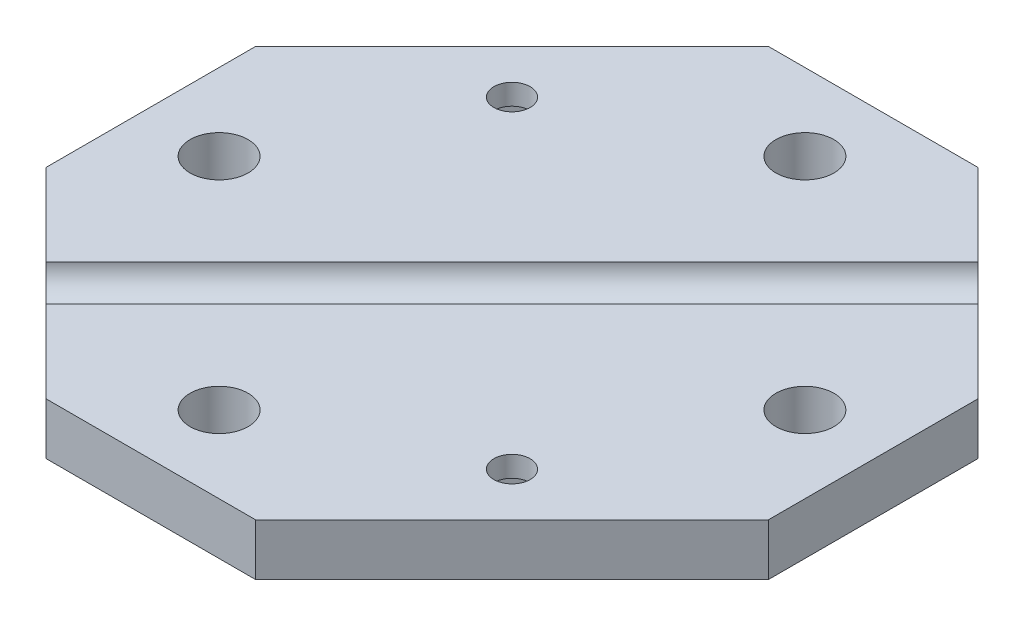
ISO-10303-21;
HEADER;
FILE_DESCRIPTION(('STEP AP214'),'2;1');
FILE_NAME('part.step','',(''),(''),'','','');
FILE_SCHEMA(('AUTOMOTIVE_DESIGN { 1 0 10303 214 1 1 1 1 }'));
ENDSEC;
DATA;
#1=APPLICATION_CONTEXT('core data for automotive mechanical design processes');
#2=APPLICATION_PROTOCOL_DEFINITION('international standard','automotive_design',2000,#1);
#3=PRODUCT_CONTEXT('',#1,'mechanical');
#4=PRODUCT('Part','Part','',(#3));
#5=PRODUCT_RELATED_PRODUCT_CATEGORY('part','',(#4));
#6=PRODUCT_DEFINITION_FORMATION('','',#4);
#7=PRODUCT_DEFINITION_CONTEXT('part definition',#1,'design');
#8=PRODUCT_DEFINITION('design','',#6,#7);
#9=PRODUCT_DEFINITION_SHAPE('','',#8);
#10=(LENGTH_UNIT() NAMED_UNIT(*) SI_UNIT(.MILLI.,.METRE.));
#11=(NAMED_UNIT(*) PLANE_ANGLE_UNIT() SI_UNIT($,.RADIAN.));
#12=(NAMED_UNIT(*) SI_UNIT($,.STERADIAN.) SOLID_ANGLE_UNIT());
#13=UNCERTAINTY_MEASURE_WITH_UNIT(LENGTH_MEASURE(1.E-05),#10,'distance_accuracy_value','');
#14=(GEOMETRIC_REPRESENTATION_CONTEXT(3) GLOBAL_UNCERTAINTY_ASSIGNED_CONTEXT((#13)) GLOBAL_UNIT_ASSIGNED_CONTEXT((#10,
#11,#12)) REPRESENTATION_CONTEXT('',''));
#15=CARTESIAN_POINT('',(0.,0.,0.));
#16=DIRECTION('',(0.,0.,1.));
#17=DIRECTION('',(1.,0.,0.));
#18=AXIS2_PLACEMENT_3D('',#15,#16,#17);
#19=CARTESIAN_POINT('',(0.,5.,0.));
#20=DIRECTION('',(0.,-1.,0.));
#21=DIRECTION('',(0.,0.,-1.));
#22=AXIS2_PLACEMENT_3D('',#19,#20,#21);
#23=PLANE('',#22);
#24=CARTESIAN_POINT('',(-23.6869337565123,5.,-23.6869337565124));
#25=DIRECTION('',(0.,1.,0.));
#26=DIRECTION('',(0.,0.,1.));
#27=AXIS2_PLACEMENT_3D('',#24,#25,#26);
#28=CIRCLE('',#27,1.75000000000001);
#29=CARTESIAN_POINT('',(-23.6869337565123,5.,-21.9369337565123));
#30=VERTEX_POINT('',#29);
#31=EDGE_CURVE('E777',#30,#30,#28,.T.);
#32=ORIENTED_EDGE('',*,*,#31,.F.);
#33=EDGE_LOOP('',(#32));
#34=FACE_BOUND('',#33,.T.);
#35=CARTESIAN_POINT('',(-32.8793219119375,5.,-4.59505066447559));
#36=DIRECTION('',(0.,1.,0.));
#37=DIRECTION('',(0.,0.,1.));
#38=AXIS2_PLACEMENT_3D('',#35,#36,#37);
#39=CIRCLE('',#38,2.8);
#40=CARTESIAN_POINT('',(-32.8793219119375,5.,-1.79505066447559));
#41=VERTEX_POINT('',#40);
#42=EDGE_CURVE('E351',#41,#41,#39,.T.);
#43=ORIENTED_EDGE('',*,*,#42,.F.);
#44=EDGE_LOOP('',(#43));
#45=FACE_BOUND('',#44,.T.);
#46=CARTESIAN_POINT('',(-4.59505066447554,5.,-32.8793219119374));
#47=DIRECTION('',(0.,1.,0.));
#48=DIRECTION('',(0.,0.,1.));
#49=AXIS2_PLACEMENT_3D('',#46,#47,#48);
#50=CIRCLE('',#49,2.8);
#51=CARTESIAN_POINT('',(-4.59505066447554,5.,-30.0793219119374));
#52=VERTEX_POINT('',#51);
#53=EDGE_CURVE('E359',#52,#52,#50,.T.);
#54=ORIENTED_EDGE('',*,*,#53,.F.);
#55=EDGE_LOOP('',(#54));
#56=FACE_BOUND('',#55,.T.);
#57=DIRECTION('',(0.707106781186547,0.,0.707106781186549));
#58=VECTOR('',#57,1.);
#59=CARTESIAN_POINT('',(-40.3039431143962,5.,4.69479422713291));
#60=LINE('',#59,#58);
#61=CARTESIAN_POINT('',(-40.3039431143962,5.,4.69479422713291));
#62=VERTEX_POINT('',#61);
#63=CARTESIAN_POINT('',(-32.3977201941393,5.,12.6010171473899));
#64=VERTEX_POINT('',#63);
#65=EDGE_CURVE('E389',#62,#64,#60,.T.);
#66=ORIENTED_EDGE('',*,*,#65,.T.);
#67=DIRECTION('',(0.707106781186549,0.,-0.707106781186546));
#68=VECTOR('',#67,1.);
#69=CARTESIAN_POINT('',(-42.0727100673626,5.,22.2760070206132));
#70=LINE('',#69,#68);
#71=CARTESIAN_POINT('',(12.60101714739,5.,-32.3977201941392));
#72=VERTEX_POINT('',#71);
#73=EDGE_CURVE('E343',#64,#72,#70,.T.);
#74=ORIENTED_EDGE('',*,*,#73,.T.);
#75=DIRECTION('',(-0.707106781186546,0.,-0.707106781186549));
#76=VECTOR('',#75,1.);
#77=CARTESIAN_POINT('',(4.69479422713301,5.,-40.3039431143962));
#78=LINE('',#77,#76);
#79=CARTESIAN_POINT('',(4.69479422713301,5.,-40.3039431143962));
#80=VERTEX_POINT('',#79);
#81=EDGE_CURVE('E402',#72,#80,#78,.T.);
#82=ORIENTED_EDGE('',*,*,#81,.T.);
#83=DIRECTION('',(-1.,0.,0.));
#84=VECTOR('',#83,1.);
#85=CARTESIAN_POINT('',(-15.555205772867,5.,-40.3039431143962));
#86=LINE('',#85,#84);
#87=CARTESIAN_POINT('',(-15.555205772867,5.,-40.3039431143962));
#88=VERTEX_POINT('',#87);
#89=EDGE_CURVE('E407',#80,#88,#86,.T.);
#90=ORIENTED_EDGE('',*,*,#89,.T.);
#91=DIRECTION('',(-0.707106781186549,0.,0.707106781186546));
#92=VECTOR('',#91,1.);
#93=CARTESIAN_POINT('',(-40.3039431143962,5.,-15.5552057728671));
#94=LINE('',#93,#92);
#95=CARTESIAN_POINT('',(-40.3039431143962,5.,-15.5552057728671));
#96=VERTEX_POINT('',#95);
#97=EDGE_CURVE('E410',#88,#96,#94,.T.);
#98=ORIENTED_EDGE('',*,*,#97,.T.);
#99=DIRECTION('',(0.,0.,1.));
#100=VECTOR('',#99,1.);
#101=CARTESIAN_POINT('',(-40.3039431143962,5.,-15.5552057728671));
#102=LINE('',#101,#100);
#103=EDGE_CURVE('E383',#96,#62,#102,.T.);
#104=ORIENTED_EDGE('',*,*,#103,.T.);
#105=EDGE_LOOP('',(#66,#74,#82,#90,#98,#104));
#106=FACE_BOUND('',#105,.T.);
#107=ADVANCED_FACE('F45',(#34,#45,#56,#106),#23,.F.);
#108=CARTESIAN_POINT('',(7.42576461569574,5.,7.42576461569574));
#109=DIRECTION('',(0.,1.,0.));
#110=DIRECTION('',(0.,0.,1.));
#111=AXIS2_PLACEMENT_3D('',#108,#109,#110);
#112=CIRCLE('',#111,1.75);
#113=CARTESIAN_POINT('',(7.42576461569574,5.,9.17576461569574));
#114=VERTEX_POINT('',#113);
#115=EDGE_CURVE('E228',#114,#114,#112,.T.);
#116=ORIENTED_EDGE('',*,*,#115,.F.);
#117=EDGE_LOOP('',(#116));
#118=FACE_BOUND('',#117,.T.);
#119=CARTESIAN_POINT('',(24.0427739735796,5.,-20.9559633679495));
#120=VERTEX_POINT('',#119);
#121=CARTESIAN_POINT('',(16.1365510533227,5.,-28.8621862882065));
#122=VERTEX_POINT('',#121);
#123=EDGE_CURVE('E403',#120,#122,#78,.T.);
#124=ORIENTED_EDGE('',*,*,#123,.T.);
#125=DIRECTION('',(0.707106781186549,0.,-0.707106781186546));
#126=VECTOR('',#125,1.);
#127=CARTESIAN_POINT('',(-38.5371761614299,5.,25.8115409265459));
#128=LINE('',#127,#126);
#129=CARTESIAN_POINT('',(-28.8621862882066,5.,16.1365510533226));
#130=VERTEX_POINT('',#129);
#131=EDGE_CURVE('E344',#130,#122,#128,.T.);
#132=ORIENTED_EDGE('',*,*,#131,.F.);
#133=CARTESIAN_POINT('',(-20.9559633679496,5.,24.0427739735796));
#134=VERTEX_POINT('',#133);
#135=EDGE_CURVE('E387',#130,#134,#60,.T.);
#136=ORIENTED_EDGE('',*,*,#135,.T.);
#137=DIRECTION('',(1.,0.,0.));
#138=VECTOR('',#137,1.);
#139=CARTESIAN_POINT('',(-0.705963367949583,5.,24.0427739735796));
#140=LINE('',#139,#138);
#141=CARTESIAN_POINT('',(-0.705963367949583,5.,24.0427739735796));
#142=VERTEX_POINT('',#141);
#143=EDGE_CURVE('E393',#134,#142,#140,.T.);
#144=ORIENTED_EDGE('',*,*,#143,.T.);
#145=DIRECTION('',(0.707106781186549,0.,-0.707106781186546));
#146=VECTOR('',#145,1.);
#147=CARTESIAN_POINT('',(-0.705963367949583,5.,24.0427739735796));
#148=LINE('',#147,#146);
#149=CARTESIAN_POINT('',(24.0427739735796,5.,-0.705963367949539));
#150=VERTEX_POINT('',#149);
#151=EDGE_CURVE('E396',#142,#150,#148,.T.);
#152=ORIENTED_EDGE('',*,*,#151,.T.);
#153=DIRECTION('',(0.,0.,-1.));
#154=VECTOR('',#153,1.);
#155=CARTESIAN_POINT('',(24.0427739735796,5.,-0.705963367949539));
#156=LINE('',#155,#154);
#157=EDGE_CURVE('E399',#150,#120,#156,.T.);
#158=ORIENTED_EDGE('',*,*,#157,.T.);
#159=EDGE_LOOP('',(#124,#132,#136,#144,#152,#158));
#160=FACE_BOUND('',#159,.T.);
#161=CARTESIAN_POINT('',(-11.6661184763411,5.,16.6181527711208));
#162=DIRECTION('',(0.,1.,0.));
#163=DIRECTION('',(0.,0.,1.));
#164=AXIS2_PLACEMENT_3D('',#161,#162,#163);
#165=CIRCLE('',#164,2.8);
#166=CARTESIAN_POINT('',(-11.6661184763411,5.,19.4181527711208));
#167=VERTEX_POINT('',#166);
#168=EDGE_CURVE('E375',#167,#167,#165,.T.);
#169=ORIENTED_EDGE('',*,*,#168,.F.);
#170=EDGE_LOOP('',(#169));
#171=FACE_BOUND('',#170,.T.);
#172=CARTESIAN_POINT('',(16.6181527711209,5.,-11.666118476341));
#173=DIRECTION('',(0.,1.,0.));
#174=DIRECTION('',(0.,0.,1.));
#175=AXIS2_PLACEMENT_3D('',#172,#173,#174);
#176=CIRCLE('',#175,2.8);
#177=CARTESIAN_POINT('',(16.6181527711209,5.,-8.86611847634102));
#178=VERTEX_POINT('',#177);
#179=EDGE_CURVE('E367',#178,#178,#176,.T.);
#180=ORIENTED_EDGE('',*,*,#179,.F.);
#181=EDGE_LOOP('',(#180));
#182=FACE_BOUND('',#181,.T.);
#183=ADVANCED_FACE('F485',(#118,#160,#171,#182),#23,.F.);
#184=CARTESIAN_POINT('',(0.,0.,0.));
#185=DIRECTION('',(0.,-1.,0.));
#186=DIRECTION('',(0.,0.,-1.));
#187=AXIS2_PLACEMENT_3D('',#184,#185,#186);
#188=PLANE('',#187);
#189=DIRECTION('',(-0.258819045102521,0.,-0.965925826289068));
#190=VECTOR('',#189,1.);
#191=CARTESIAN_POINT('',(-20.5081718023086,0.,-22.8351870579527));
#192=LINE('',#191,#190);
#193=CARTESIAN_POINT('',(-20.5081718023086,0.,-22.8351870579527));
#194=VERTEX_POINT('',#193);
#195=CARTESIAN_POINT('',(-21.3599185008683,0.,-26.0139490121564));
#196=VERTEX_POINT('',#195);
#197=EDGE_CURVE('E199',#194,#196,#192,.T.);
#198=ORIENTED_EDGE('',*,*,#197,.T.);
#199=DIRECTION('',(-0.965925826289068,0.,-0.258819045102521));
#200=VECTOR('',#199,1.);
#201=CARTESIAN_POINT('',(-21.3599185008683,0.,-26.0139490121564));
#202=LINE('',#201,#200);
#203=CARTESIAN_POINT('',(-24.5386804550719,0.,-26.865695710716));
#204=VERTEX_POINT('',#203);
#205=EDGE_CURVE('E211',#196,#204,#202,.T.);
#206=ORIENTED_EDGE('',*,*,#205,.T.);
#207=DIRECTION('',(-0.707106781186548,0.,0.707106781186548));
#208=VECTOR('',#207,1.);
#209=CARTESIAN_POINT('',(-24.5386804550719,0.,-26.865695710716));
#210=LINE('',#209,#208);
#211=CARTESIAN_POINT('',(-26.865695710716,0.,-24.538680455072));
#212=VERTEX_POINT('',#211);
#213=EDGE_CURVE('E61',#204,#212,#210,.T.);
#214=ORIENTED_EDGE('',*,*,#213,.T.);
#215=DIRECTION('',(0.258819045102521,0.,0.965925826289068));
#216=VECTOR('',#215,1.);
#217=CARTESIAN_POINT('',(-26.865695710716,0.,-24.538680455072));
#218=LINE('',#217,#216);
#219=CARTESIAN_POINT('',(-26.0139490121563,0.,-21.3599185008683));
#220=VERTEX_POINT('',#219);
#221=EDGE_CURVE('E233',#212,#220,#218,.T.);
#222=ORIENTED_EDGE('',*,*,#221,.T.);
#223=DIRECTION('',(0.965925826289068,0.,0.258819045102521));
#224=VECTOR('',#223,1.);
#225=CARTESIAN_POINT('',(-26.0139490121563,0.,-21.3599185008683));
#226=LINE('',#225,#224);
#227=CARTESIAN_POINT('',(-22.8351870579526,0.,-20.5081718023087));
#228=VERTEX_POINT('',#227);
#229=EDGE_CURVE('E237',#220,#228,#226,.T.);
#230=ORIENTED_EDGE('',*,*,#229,.T.);
#231=DIRECTION('',(0.707106781186548,0.,-0.707106781186548));
#232=VECTOR('',#231,1.);
#233=CARTESIAN_POINT('',(-22.8351870579526,0.,-20.5081718023087));
#234=LINE('',#233,#232);
#235=EDGE_CURVE('E208',#228,#194,#234,.T.);
#236=ORIENTED_EDGE('',*,*,#235,.T.);
#237=EDGE_LOOP('',(#198,#206,#214,#222,#230,#236));
#238=FACE_BOUND('',#237,.T.);
#239=DIRECTION('',(-0.258819045102519,0.,-0.965925826289069));
#240=VECTOR('',#239,1.);
#241=CARTESIAN_POINT('',(10.6045265698995,0.,8.27751131425526));
#242=LINE('',#241,#240);
#243=CARTESIAN_POINT('',(10.6045265698995,0.,8.27751131425526));
#244=VERTEX_POINT('',#243);
#245=CARTESIAN_POINT('',(9.75277987133989,0.,5.09874936005159));
#246=VERTEX_POINT('',#245);
#247=EDGE_CURVE('E299',#244,#246,#242,.T.);
#248=ORIENTED_EDGE('',*,*,#247,.T.);
#249=DIRECTION('',(-0.965925826289068,0.,-0.258819045102522));
#250=VECTOR('',#249,1.);
#251=CARTESIAN_POINT('',(9.75277987133989,0.,5.09874936005159));
#252=LINE('',#251,#250);
#253=CARTESIAN_POINT('',(6.57401791713622,0.,4.24700266149193));
#254=VERTEX_POINT('',#253);
#255=EDGE_CURVE('E331',#246,#254,#252,.T.);
#256=ORIENTED_EDGE('',*,*,#255,.T.);
#257=DIRECTION('',(-0.707106781186549,0.,0.707106781186547));
#258=VECTOR('',#257,1.);
#259=CARTESIAN_POINT('',(6.57401791713622,0.,4.24700266149193));
#260=LINE('',#259,#258);
#261=CARTESIAN_POINT('',(4.2470026614922,0.,6.57401791713594));
#262=VERTEX_POINT('',#261);
#263=EDGE_CURVE('E69',#254,#262,#260,.T.);
#264=ORIENTED_EDGE('',*,*,#263,.T.);
#265=DIRECTION('',(0.258819045102519,0.,0.965925826289069));
#266=VECTOR('',#265,1.);
#267=CARTESIAN_POINT('',(4.2470026614922,0.,6.57401791713594));
#268=LINE('',#267,#266);
#269=CARTESIAN_POINT('',(5.09874936005185,0.,9.75277987133961));
#270=VERTEX_POINT('',#269);
#271=EDGE_CURVE('E325',#262,#270,#268,.T.);
#272=ORIENTED_EDGE('',*,*,#271,.T.);
#273=DIRECTION('',(0.965925826289068,0.,0.258819045102522));
#274=VECTOR('',#273,1.);
#275=CARTESIAN_POINT('',(5.09874936005185,0.,9.75277987133961));
#276=LINE('',#275,#274);
#277=CARTESIAN_POINT('',(8.27751131425551,0.,10.6045265698993));
#278=VERTEX_POINT('',#277);
#279=EDGE_CURVE('E321',#270,#278,#276,.T.);
#280=ORIENTED_EDGE('',*,*,#279,.T.);
#281=DIRECTION('',(0.707106781186549,0.,-0.707106781186546));
#282=VECTOR('',#281,1.);
#283=CARTESIAN_POINT('',(8.27751131425551,0.,10.6045265698993));
#284=LINE('',#283,#282);
#285=EDGE_CURVE('E277',#278,#244,#284,.T.);
#286=ORIENTED_EDGE('',*,*,#285,.T.);
#287=EDGE_LOOP('',(#248,#256,#264,#272,#280,#286));
#288=FACE_BOUND('',#287,.T.);
#289=CARTESIAN_POINT('',(-4.59505066447554,0.,-32.8793219119374));
#290=DIRECTION('',(0.,1.,0.));
#291=DIRECTION('',(0.,0.,1.));
#292=AXIS2_PLACEMENT_3D('',#289,#290,#291);
#293=CIRCLE('',#292,2.8);
#294=CARTESIAN_POINT('',(-4.59505066447554,0.,-30.0793219119374));
#295=VERTEX_POINT('',#294);
#296=EDGE_CURVE('E355',#295,#295,#293,.T.);
#297=ORIENTED_EDGE('',*,*,#296,.T.);
#298=EDGE_LOOP('',(#297));
#299=FACE_BOUND('',#298,.T.);
#300=CARTESIAN_POINT('',(-11.6661184763411,0.,16.6181527711208));
#301=DIRECTION('',(0.,1.,0.));
#302=DIRECTION('',(0.,0.,1.));
#303=AXIS2_PLACEMENT_3D('',#300,#301,#302);
#304=CIRCLE('',#303,2.8);
#305=CARTESIAN_POINT('',(-11.6661184763411,0.,19.4181527711208));
#306=VERTEX_POINT('',#305);
#307=EDGE_CURVE('E371',#306,#306,#304,.T.);
#308=ORIENTED_EDGE('',*,*,#307,.T.);
#309=EDGE_LOOP('',(#308));
#310=FACE_BOUND('',#309,.T.);
#311=DIRECTION('',(0.,0.,1.));
#312=VECTOR('',#311,1.);
#313=CARTESIAN_POINT('',(-40.3039431143962,0.,-15.5552057728671));
#314=LINE('',#313,#312);
#315=CARTESIAN_POINT('',(-40.3039431143962,0.,-15.5552057728671));
#316=VERTEX_POINT('',#315);
#317=CARTESIAN_POINT('',(-40.3039431143962,0.,4.69479422713291));
#318=VERTEX_POINT('',#317);
#319=EDGE_CURVE('E379',#316,#318,#314,.T.);
#320=ORIENTED_EDGE('',*,*,#319,.F.);
#321=DIRECTION('',(-0.707106781186549,0.,0.707106781186546));
#322=VECTOR('',#321,1.);
#323=CARTESIAN_POINT('',(-40.3039431143962,0.,-15.5552057728671));
#324=LINE('',#323,#322);
#325=CARTESIAN_POINT('',(-15.555205772867,0.,-40.3039431143962));
#326=VERTEX_POINT('',#325);
#327=EDGE_CURVE('E388',#326,#316,#324,.T.);
#328=ORIENTED_EDGE('',*,*,#327,.F.);
#329=DIRECTION('',(-1.,0.,0.));
#330=VECTOR('',#329,1.);
#331=CARTESIAN_POINT('',(-15.555205772867,0.,-40.3039431143962));
#332=LINE('',#331,#330);
#333=CARTESIAN_POINT('',(4.69479422713301,0.,-40.3039431143962));
#334=VERTEX_POINT('',#333);
#335=EDGE_CURVE('E432',#334,#326,#332,.T.);
#336=ORIENTED_EDGE('',*,*,#335,.F.);
#337=DIRECTION('',(-0.707106781186546,0.,-0.707106781186549));
#338=VECTOR('',#337,1.);
#339=CARTESIAN_POINT('',(4.69479422713301,0.,-40.3039431143962));
#340=LINE('',#339,#338);
#341=CARTESIAN_POINT('',(24.0427739735796,0.,-20.9559633679495));
#342=VERTEX_POINT('',#341);
#343=EDGE_CURVE('E429',#342,#334,#340,.T.);
#344=ORIENTED_EDGE('',*,*,#343,.F.);
#345=DIRECTION('',(0.,0.,-1.));
#346=VECTOR('',#345,1.);
#347=CARTESIAN_POINT('',(24.0427739735796,0.,-0.705963367949539));
#348=LINE('',#347,#346);
#349=CARTESIAN_POINT('',(24.0427739735796,0.,-0.705963367949539));
#350=VERTEX_POINT('',#349);
#351=EDGE_CURVE('E426',#350,#342,#348,.T.);
#352=ORIENTED_EDGE('',*,*,#351,.F.);
#353=DIRECTION('',(0.707106781186549,0.,-0.707106781186546));
#354=VECTOR('',#353,1.);
#355=CARTESIAN_POINT('',(-0.705963367949583,0.,24.0427739735796));
#356=LINE('',#355,#354);
#357=CARTESIAN_POINT('',(-0.705963367949583,0.,24.0427739735796));
#358=VERTEX_POINT('',#357);
#359=EDGE_CURVE('E423',#358,#350,#356,.T.);
#360=ORIENTED_EDGE('',*,*,#359,.F.);
#361=DIRECTION('',(1.,0.,0.));
#362=VECTOR('',#361,1.);
#363=CARTESIAN_POINT('',(-0.705963367949583,0.,24.0427739735796));
#364=LINE('',#363,#362);
#365=CARTESIAN_POINT('',(-20.9559633679496,0.,24.0427739735796));
#366=VERTEX_POINT('',#365);
#367=EDGE_CURVE('E420',#366,#358,#364,.T.);
#368=ORIENTED_EDGE('',*,*,#367,.F.);
#369=DIRECTION('',(0.707106781186547,0.,0.707106781186549));
#370=VECTOR('',#369,1.);
#371=CARTESIAN_POINT('',(-40.3039431143962,0.,4.69479422713291));
#372=LINE('',#371,#370);
#373=EDGE_CURVE('E417',#318,#366,#372,.T.);
#374=ORIENTED_EDGE('',*,*,#373,.F.);
#375=EDGE_LOOP('',(#320,#328,#336,#344,#352,#360,#368,#374));
#376=FACE_BOUND('',#375,.T.);
#377=CARTESIAN_POINT('',(16.6181527711209,0.,-11.666118476341));
#378=DIRECTION('',(0.,1.,0.));
#379=DIRECTION('',(0.,0.,1.));
#380=AXIS2_PLACEMENT_3D('',#377,#378,#379);
#381=CIRCLE('',#380,2.8);
#382=CARTESIAN_POINT('',(16.6181527711209,0.,-8.86611847634102));
#383=VERTEX_POINT('',#382);
#384=EDGE_CURVE('E363',#383,#383,#381,.T.);
#385=ORIENTED_EDGE('',*,*,#384,.T.);
#386=EDGE_LOOP('',(#385));
#387=FACE_BOUND('',#386,.T.);
#388=CARTESIAN_POINT('',(-32.8793219119375,0.,-4.59505066447559));
#389=DIRECTION('',(0.,1.,0.));
#390=DIRECTION('',(0.,0.,1.));
#391=AXIS2_PLACEMENT_3D('',#388,#389,#390);
#392=CIRCLE('',#391,2.8);
#393=CARTESIAN_POINT('',(-32.8793219119375,0.,-1.79505066447559));
#394=VERTEX_POINT('',#393);
#395=EDGE_CURVE('E347',#394,#394,#392,.T.);
#396=ORIENTED_EDGE('',*,*,#395,.T.);
#397=EDGE_LOOP('',(#396));
#398=FACE_BOUND('',#397,.T.);
#399=ADVANCED_FACE('F216',(#238,#288,#299,#310,#376,#387,#398),#188,.T.);
#400=CARTESIAN_POINT('',(-40.3039431143962,5.,-15.5552057728671));
#401=DIRECTION('',(1.,0.,0.));
#402=DIRECTION('',(0.,0.,-1.));
#403=AXIS2_PLACEMENT_3D('',#400,#401,#402);
#404=PLANE('',#403);
#405=ORIENTED_EDGE('',*,*,#319,.T.);
#406=DIRECTION('',(0.,-1.,0.));
#407=VECTOR('',#406,1.);
#408=CARTESIAN_POINT('',(-40.3039431143962,5.,4.69479422713291));
#409=LINE('',#408,#407);
#410=EDGE_CURVE('E11',#62,#318,#409,.T.);
#411=ORIENTED_EDGE('',*,*,#410,.F.);
#412=ORIENTED_EDGE('',*,*,#103,.F.);
#413=DIRECTION('',(0.,-1.,0.));
#414=VECTOR('',#413,1.);
#415=CARTESIAN_POINT('',(-40.3039431143962,5.,-15.5552057728671));
#416=LINE('',#415,#414);
#417=EDGE_CURVE('E413',#96,#316,#416,.T.);
#418=ORIENTED_EDGE('',*,*,#417,.T.);
#419=EDGE_LOOP('',(#405,#411,#412,#418));
#420=FACE_BOUND('',#419,.T.);
#421=ADVANCED_FACE('F47',(#420),#404,.F.);
#422=CARTESIAN_POINT('',(-40.3039431143962,5.,4.69479422713291));
#423=DIRECTION('',(0.707106781186548,0.,-0.707106781186547));
#424=DIRECTION('',(-0.707106781186547,0.,-0.707106781186548));
#425=AXIS2_PLACEMENT_3D('',#422,#423,#424);
#426=PLANE('',#425);
#427=ORIENTED_EDGE('',*,*,#135,.F.);
#428=CARTESIAN_POINT('',(-30.6299532411729,5.,14.3687841003562));
#429=DIRECTION('',(0.707106781186548,0.,-0.707106781186547));
#430=DIRECTION('',(-0.707106781186547,0.,-0.707106781186548));
#431=AXIS2_PLACEMENT_3D('',#428,#429,#430);
#432=CIRCLE('',#431,2.5);
#433=EDGE_CURVE('E262',#64,#130,#432,.F.);
#434=ORIENTED_EDGE('',*,*,#433,.F.);
#435=ORIENTED_EDGE('',*,*,#65,.F.);
#436=ORIENTED_EDGE('',*,*,#410,.T.);
#437=ORIENTED_EDGE('',*,*,#373,.T.);
#438=DIRECTION('',(0.,-1.,0.));
#439=VECTOR('',#438,1.);
#440=CARTESIAN_POINT('',(-20.9559633679496,5.,24.0427739735796));
#441=LINE('',#440,#439);
#442=EDGE_CURVE('E54',#134,#366,#441,.T.);
#443=ORIENTED_EDGE('',*,*,#442,.F.);
#444=EDGE_LOOP('',(#427,#434,#435,#436,#437,#443));
#445=FACE_BOUND('',#444,.T.);
#446=ADVANCED_FACE('F510',(#445),#426,.F.);
#447=CARTESIAN_POINT('',(-0.705963367949583,5.,24.0427739735796));
#448=DIRECTION('',(0.,0.,-1.));
#449=DIRECTION('',(-1.,0.,0.));
#450=AXIS2_PLACEMENT_3D('',#447,#448,#449);
#451=PLANE('',#450);
#452=ORIENTED_EDGE('',*,*,#367,.T.);
#453=DIRECTION('',(0.,-1.,0.));
#454=VECTOR('',#453,1.);
#455=CARTESIAN_POINT('',(-0.705963367949583,5.,24.0427739735796));
#456=LINE('',#455,#454);
#457=EDGE_CURVE('E456',#142,#358,#456,.T.);
#458=ORIENTED_EDGE('',*,*,#457,.F.);
#459=ORIENTED_EDGE('',*,*,#143,.F.);
#460=ORIENTED_EDGE('',*,*,#442,.T.);
#461=EDGE_LOOP('',(#452,#458,#459,#460));
#462=FACE_BOUND('',#461,.T.);
#463=ADVANCED_FACE('F465',(#462),#451,.F.);
#464=CARTESIAN_POINT('',(-0.705963367949583,5.,24.0427739735796));
#465=DIRECTION('',(-0.707106781186546,0.,-0.707106781186549));
#466=DIRECTION('',(-0.707106781186549,0.,0.707106781186546));
#467=AXIS2_PLACEMENT_3D('',#464,#465,#466);
#468=PLANE('',#467);
#469=ORIENTED_EDGE('',*,*,#359,.T.);
#470=DIRECTION('',(0.,-1.,0.));
#471=VECTOR('',#470,1.);
#472=CARTESIAN_POINT('',(24.0427739735796,5.,-0.705963367949539));
#473=LINE('',#472,#471);
#474=EDGE_CURVE('E452',#150,#350,#473,.T.);
#475=ORIENTED_EDGE('',*,*,#474,.F.);
#476=ORIENTED_EDGE('',*,*,#151,.F.);
#477=ORIENTED_EDGE('',*,*,#457,.T.);
#478=EDGE_LOOP('',(#469,#475,#476,#477));
#479=FACE_BOUND('',#478,.T.);
#480=ADVANCED_FACE('F477',(#479),#468,.F.);
#481=CARTESIAN_POINT('',(24.0427739735796,5.,-0.705963367949539));
#482=DIRECTION('',(-1.,0.,0.));
#483=DIRECTION('',(0.,0.,1.));
#484=AXIS2_PLACEMENT_3D('',#481,#482,#483);
#485=PLANE('',#484);
#486=ORIENTED_EDGE('',*,*,#351,.T.);
#487=DIRECTION('',(0.,-1.,0.));
#488=VECTOR('',#487,1.);
#489=CARTESIAN_POINT('',(24.0427739735796,5.,-20.9559633679495));
#490=LINE('',#489,#488);
#491=EDGE_CURVE('E448',#120,#342,#490,.T.);
#492=ORIENTED_EDGE('',*,*,#491,.F.);
#493=ORIENTED_EDGE('',*,*,#157,.F.);
#494=ORIENTED_EDGE('',*,*,#474,.T.);
#495=EDGE_LOOP('',(#486,#492,#493,#494));
#496=FACE_BOUND('',#495,.T.);
#497=ADVANCED_FACE('F481',(#496),#485,.F.);
#498=CARTESIAN_POINT('',(4.69479422713301,5.,-40.3039431143962));
#499=DIRECTION('',(-0.707106781186549,0.,0.707106781186546));
#500=DIRECTION('',(0.707106781186546,0.,0.707106781186549));
#501=AXIS2_PLACEMENT_3D('',#498,#499,#500);
#502=PLANE('',#501);
#503=ORIENTED_EDGE('',*,*,#81,.F.);
#504=CARTESIAN_POINT('',(14.3687841003563,5.,-30.6299532411729));
#505=DIRECTION('',(0.707106781186549,0.,-0.707106781186546));
#506=DIRECTION('',(-0.707106781186546,0.,-0.707106781186549));
#507=AXIS2_PLACEMENT_3D('',#504,#505,#506);
#508=CIRCLE('',#507,2.5);
#509=EDGE_CURVE('E340',#122,#72,#508,.T.);
#510=ORIENTED_EDGE('',*,*,#509,.F.);
#511=ORIENTED_EDGE('',*,*,#123,.F.);
#512=ORIENTED_EDGE('',*,*,#491,.T.);
#513=ORIENTED_EDGE('',*,*,#343,.T.);
#514=DIRECTION('',(0.,-1.,0.));
#515=VECTOR('',#514,1.);
#516=CARTESIAN_POINT('',(4.69479422713301,5.,-40.3039431143962));
#517=LINE('',#516,#515);
#518=EDGE_CURVE('E444',#80,#334,#517,.T.);
#519=ORIENTED_EDGE('',*,*,#518,.F.);
#520=EDGE_LOOP('',(#503,#510,#511,#512,#513,#519));
#521=FACE_BOUND('',#520,.T.);
#522=ADVANCED_FACE('F498',(#521),#502,.F.);
#523=CARTESIAN_POINT('',(-15.555205772867,5.,-40.3039431143962));
#524=DIRECTION('',(0.,0.,1.));
#525=DIRECTION('',(1.,0.,0.));
#526=AXIS2_PLACEMENT_3D('',#523,#524,#525);
#527=PLANE('',#526);
#528=ORIENTED_EDGE('',*,*,#335,.T.);
#529=DIRECTION('',(0.,-1.,0.));
#530=VECTOR('',#529,1.);
#531=CARTESIAN_POINT('',(-15.555205772867,5.,-40.3039431143962));
#532=LINE('',#531,#530);
#533=EDGE_CURVE('E440',#88,#326,#532,.T.);
#534=ORIENTED_EDGE('',*,*,#533,.F.);
#535=ORIENTED_EDGE('',*,*,#89,.F.);
#536=ORIENTED_EDGE('',*,*,#518,.T.);
#537=EDGE_LOOP('',(#528,#534,#535,#536));
#538=FACE_BOUND('',#537,.T.);
#539=ADVANCED_FACE('F501',(#538),#527,.F.);
#540=CARTESIAN_POINT('',(-40.3039431143962,5.,-15.5552057728671));
#541=DIRECTION('',(0.707106781186546,0.,0.707106781186549));
#542=DIRECTION('',(0.707106781186549,0.,-0.707106781186546));
#543=AXIS2_PLACEMENT_3D('',#540,#541,#542);
#544=PLANE('',#543);
#545=ORIENTED_EDGE('',*,*,#327,.T.);
#546=ORIENTED_EDGE('',*,*,#417,.F.);
#547=ORIENTED_EDGE('',*,*,#97,.F.);
#548=ORIENTED_EDGE('',*,*,#533,.T.);
#549=EDGE_LOOP('',(#545,#546,#547,#548));
#550=FACE_BOUND('',#549,.T.);
#551=ADVANCED_FACE('F506',(#550),#544,.F.);
#552=CARTESIAN_POINT('',(-11.6661184763411,5.,16.6181527711208));
#553=DIRECTION('',(0.,-1.,0.));
#554=DIRECTION('',(0.,0.,-1.));
#555=AXIS2_PLACEMENT_3D('',#552,#553,#554);
#556=CYLINDRICAL_SURFACE('',#555,2.8);
#557=ORIENTED_EDGE('',*,*,#168,.T.);
#558=EDGE_LOOP('',(#557));
#559=FACE_BOUND('',#558,.T.);
#560=ORIENTED_EDGE('',*,*,#307,.F.);
#561=EDGE_LOOP('',(#560));
#562=FACE_BOUND('',#561,.T.);
#563=ADVANCED_FACE('F542',(#559,#562),#556,.F.);
#564=CARTESIAN_POINT('',(16.6181527711209,5.,-11.666118476341));
#565=DIRECTION('',(0.,-1.,0.));
#566=DIRECTION('',(0.,0.,-1.));
#567=AXIS2_PLACEMENT_3D('',#564,#565,#566);
#568=CYLINDRICAL_SURFACE('',#567,2.8);
#569=ORIENTED_EDGE('',*,*,#179,.T.);
#570=EDGE_LOOP('',(#569));
#571=FACE_BOUND('',#570,.T.);
#572=ORIENTED_EDGE('',*,*,#384,.F.);
#573=EDGE_LOOP('',(#572));
#574=FACE_BOUND('',#573,.T.);
#575=ADVANCED_FACE('F595',(#571,#574),#568,.F.);
#576=CARTESIAN_POINT('',(-4.59505066447554,5.,-32.8793219119374));
#577=DIRECTION('',(0.,-1.,0.));
#578=DIRECTION('',(0.,0.,-1.));
#579=AXIS2_PLACEMENT_3D('',#576,#577,#578);
#580=CYLINDRICAL_SURFACE('',#579,2.8);
#581=ORIENTED_EDGE('',*,*,#53,.T.);
#582=EDGE_LOOP('',(#581));
#583=FACE_BOUND('',#582,.T.);
#584=ORIENTED_EDGE('',*,*,#296,.F.);
#585=EDGE_LOOP('',(#584));
#586=FACE_BOUND('',#585,.T.);
#587=ADVANCED_FACE('F526',(#583,#586),#580,.F.);
#588=CARTESIAN_POINT('',(-32.8793219119375,5.,-4.59505066447559));
#589=DIRECTION('',(0.,-1.,0.));
#590=DIRECTION('',(0.,0.,-1.));
#591=AXIS2_PLACEMENT_3D('',#588,#589,#590);
#592=CYLINDRICAL_SURFACE('',#591,2.8);
#593=ORIENTED_EDGE('',*,*,#42,.T.);
#594=EDGE_LOOP('',(#593));
#595=FACE_BOUND('',#594,.T.);
#596=ORIENTED_EDGE('',*,*,#395,.F.);
#597=EDGE_LOOP('',(#596));
#598=FACE_BOUND('',#597,.T.);
#599=ADVANCED_FACE('F515',(#595,#598),#592,.F.);
#600=CARTESIAN_POINT('',(-40.3049431143963,5.,24.0437739735795));
#601=DIRECTION('',(0.707106781186549,0.,-0.707106781186546));
#602=DIRECTION('',(-0.707106781186546,0.,-0.707106781186549));
#603=AXIS2_PLACEMENT_3D('',#600,#601,#602);
#604=CYLINDRICAL_SURFACE('',#603,2.5);
#605=ORIENTED_EDGE('',*,*,#433,.T.);
#606=ORIENTED_EDGE('',*,*,#131,.T.);
#607=ORIENTED_EDGE('',*,*,#509,.T.);
#608=ORIENTED_EDGE('',*,*,#73,.F.);
#609=EDGE_LOOP('',(#605,#606,#607,#608));
#610=FACE_BOUND('',#609,.T.);
#611=ADVANCED_FACE('F512',(#610),#604,.F.);
#612=CARTESIAN_POINT('',(10.6045265698995,0.,8.27751131425526));
#613=DIRECTION('',(0.965925826289069,0.,-0.258819045102519));
#614=DIRECTION('',(-0.258819045102519,0.,-0.965925826289069));
#615=AXIS2_PLACEMENT_3D('',#612,#613,#614);
#616=PLANE('',#615);
#617=DIRECTION('',(-0.258819045102519,0.,-0.965925826289069));
#618=VECTOR('',#617,1.);
#619=CARTESIAN_POINT('',(10.6045265698995,3.,8.27751131425526));
#620=LINE('',#619,#618);
#621=CARTESIAN_POINT('',(10.6045265698995,3.,8.27751131425526));
#622=VERTEX_POINT('',#621);
#623=CARTESIAN_POINT('',(9.75277987133989,3.,5.09874936005159));
#624=VERTEX_POINT('',#623);
#625=EDGE_CURVE('E245',#622,#624,#620,.T.);
#626=ORIENTED_EDGE('',*,*,#625,.T.);
#627=DIRECTION('',(0.,1.,0.));
#628=VECTOR('',#627,1.);
#629=CARTESIAN_POINT('',(9.75277987133989,0.,5.09874936005159));
#630=LINE('',#629,#628);
#631=EDGE_CURVE('E274',#246,#624,#630,.T.);
#632=ORIENTED_EDGE('',*,*,#631,.F.);
#633=ORIENTED_EDGE('',*,*,#247,.F.);
#634=DIRECTION('',(0.,1.,0.));
#635=VECTOR('',#634,1.);
#636=CARTESIAN_POINT('',(10.6045265698995,0.,8.27751131425526));
#637=LINE('',#636,#635);
#638=EDGE_CURVE('E290',#244,#622,#637,.T.);
#639=ORIENTED_EDGE('',*,*,#638,.T.);
#640=EDGE_LOOP('',(#626,#632,#633,#639));
#641=FACE_BOUND('',#640,.T.);
#642=ADVANCED_FACE('F514',(#641),#616,.F.);
#643=CARTESIAN_POINT('',(8.27751131425551,0.,10.6045265698993));
#644=DIRECTION('',(0.707106781186546,0.,0.707106781186549));
#645=DIRECTION('',(0.707106781186549,0.,-0.707106781186546));
#646=AXIS2_PLACEMENT_3D('',#643,#644,#645);
#647=PLANE('',#646);
#648=DIRECTION('',(0.707106781186549,0.,-0.707106781186546));
#649=VECTOR('',#648,1.);
#650=CARTESIAN_POINT('',(8.27751131425551,3.,10.6045265698993));
#651=LINE('',#650,#649);
#652=CARTESIAN_POINT('',(8.27751131425551,3.,10.6045265698993));
#653=VERTEX_POINT('',#652);
#654=EDGE_CURVE('E294',#653,#622,#651,.T.);
#655=ORIENTED_EDGE('',*,*,#654,.T.);
#656=ORIENTED_EDGE('',*,*,#638,.F.);
#657=ORIENTED_EDGE('',*,*,#285,.F.);
#658=DIRECTION('',(0.,1.,0.));
#659=VECTOR('',#658,1.);
#660=CARTESIAN_POINT('',(8.27751131425551,0.,10.6045265698993));
#661=LINE('',#660,#659);
#662=EDGE_CURVE('E287',#278,#653,#661,.T.);
#663=ORIENTED_EDGE('',*,*,#662,.T.);
#664=EDGE_LOOP('',(#655,#656,#657,#663));
#665=FACE_BOUND('',#664,.T.);
#666=ADVANCED_FACE('F522',(#665),#647,.F.);
#667=CARTESIAN_POINT('',(5.09874936005185,0.,9.75277987133961));
#668=DIRECTION('',(-0.258819045102522,0.,0.965925826289068));
#669=DIRECTION('',(0.965925826289068,0.,0.258819045102522));
#670=AXIS2_PLACEMENT_3D('',#667,#668,#669);
#671=PLANE('',#670);
#672=DIRECTION('',(0.965925826289068,0.,0.258819045102522));
#673=VECTOR('',#672,1.);
#674=CARTESIAN_POINT('',(5.09874936005185,3.,9.75277987133961));
#675=LINE('',#674,#673);
#676=CARTESIAN_POINT('',(5.09874936005185,3.,9.75277987133961));
#677=VERTEX_POINT('',#676);
#678=EDGE_CURVE('E298',#677,#653,#675,.T.);
#679=ORIENTED_EDGE('',*,*,#678,.T.);
#680=ORIENTED_EDGE('',*,*,#662,.F.);
#681=ORIENTED_EDGE('',*,*,#279,.F.);
#682=DIRECTION('',(0.,1.,0.));
#683=VECTOR('',#682,1.);
#684=CARTESIAN_POINT('',(5.09874936005185,0.,9.75277987133961));
#685=LINE('',#684,#683);
#686=EDGE_CURVE('E284',#270,#677,#685,.T.);
#687=ORIENTED_EDGE('',*,*,#686,.T.);
#688=EDGE_LOOP('',(#679,#680,#681,#687));
#689=FACE_BOUND('',#688,.T.);
#690=ADVANCED_FACE('F640',(#689),#671,.F.);
#691=CARTESIAN_POINT('',(4.2470026614922,0.,6.57401791713594));
#692=DIRECTION('',(-0.965925826289069,0.,0.258819045102519));
#693=DIRECTION('',(0.258819045102519,0.,0.965925826289069));
#694=AXIS2_PLACEMENT_3D('',#691,#692,#693);
#695=PLANE('',#694);
#696=DIRECTION('',(0.258819045102519,0.,0.965925826289069));
#697=VECTOR('',#696,1.);
#698=CARTESIAN_POINT('',(4.2470026614922,3.,6.57401791713594));
#699=LINE('',#698,#697);
#700=CARTESIAN_POINT('',(4.2470026614922,3.,6.57401791713594));
#701=VERTEX_POINT('',#700);
#702=EDGE_CURVE('E303',#701,#677,#699,.T.);
#703=ORIENTED_EDGE('',*,*,#702,.T.);
#704=ORIENTED_EDGE('',*,*,#686,.F.);
#705=ORIENTED_EDGE('',*,*,#271,.F.);
#706=DIRECTION('',(0.,1.,0.));
#707=VECTOR('',#706,1.);
#708=CARTESIAN_POINT('',(4.2470026614922,0.,6.57401791713594));
#709=LINE('',#708,#707);
#710=EDGE_CURVE('E281',#262,#701,#709,.T.);
#711=ORIENTED_EDGE('',*,*,#710,.T.);
#712=EDGE_LOOP('',(#703,#704,#705,#711));
#713=FACE_BOUND('',#712,.T.);
#714=ADVANCED_FACE('F650',(#713),#695,.F.);
#715=CARTESIAN_POINT('',(6.57401791713622,0.,4.24700266149193));
#716=DIRECTION('',(-0.707106781186547,0.,-0.707106781186548));
#717=DIRECTION('',(-0.707106781186548,0.,0.707106781186547));
#718=AXIS2_PLACEMENT_3D('',#715,#716,#717);
#719=PLANE('',#718);
#720=DIRECTION('',(-0.707106781186549,0.,0.707106781186547));
#721=VECTOR('',#720,1.);
#722=CARTESIAN_POINT('',(6.57401791713622,3.,4.24700266149193));
#723=LINE('',#722,#721);
#724=CARTESIAN_POINT('',(6.57401791713622,3.,4.24700266149193));
#725=VERTEX_POINT('',#724);
#726=EDGE_CURVE('E307',#725,#701,#723,.T.);
#727=ORIENTED_EDGE('',*,*,#726,.T.);
#728=ORIENTED_EDGE('',*,*,#710,.F.);
#729=ORIENTED_EDGE('',*,*,#263,.F.);
#730=DIRECTION('',(0.,1.,0.));
#731=VECTOR('',#730,1.);
#732=CARTESIAN_POINT('',(6.57401791713622,0.,4.24700266149193));
#733=LINE('',#732,#731);
#734=EDGE_CURVE('E278',#254,#725,#733,.T.);
#735=ORIENTED_EDGE('',*,*,#734,.T.);
#736=EDGE_LOOP('',(#727,#728,#729,#735));
#737=FACE_BOUND('',#736,.T.);
#738=ADVANCED_FACE('F660',(#737),#719,.F.);
#739=CARTESIAN_POINT('',(9.75277987133989,0.,5.09874936005159));
#740=DIRECTION('',(0.258819045102522,0.,-0.965925826289068));
#741=DIRECTION('',(-0.965925826289068,0.,-0.258819045102523));
#742=AXIS2_PLACEMENT_3D('',#739,#740,#741);
#743=PLANE('',#742);
#744=DIRECTION('',(-0.965925826289068,0.,-0.258819045102522));
#745=VECTOR('',#744,1.);
#746=CARTESIAN_POINT('',(9.75277987133989,3.,5.09874936005159));
#747=LINE('',#746,#745);
#748=EDGE_CURVE('E311',#624,#725,#747,.T.);
#749=ORIENTED_EDGE('',*,*,#748,.T.);
#750=ORIENTED_EDGE('',*,*,#734,.F.);
#751=ORIENTED_EDGE('',*,*,#255,.F.);
#752=ORIENTED_EDGE('',*,*,#631,.T.);
#753=EDGE_LOOP('',(#749,#750,#751,#752));
#754=FACE_BOUND('',#753,.T.);
#755=ADVANCED_FACE('F670',(#754),#743,.F.);
#756=CARTESIAN_POINT('',(0.,3.,0.));
#757=DIRECTION('',(0.,1.,0.));
#758=DIRECTION('',(0.,0.,1.));
#759=AXIS2_PLACEMENT_3D('',#756,#757,#758);
#760=PLANE('',#759);
#761=CARTESIAN_POINT('',(7.42576461569574,3.,7.42576461569574));
#762=DIRECTION('',(0.,1.,0.));
#763=DIRECTION('',(0.,0.,1.));
#764=AXIS2_PLACEMENT_3D('',#761,#762,#763);
#765=CIRCLE('',#764,1.75);
#766=CARTESIAN_POINT('',(7.42576461569574,3.,9.17576461569574));
#767=VERTEX_POINT('',#766);
#768=EDGE_CURVE('E784',#767,#767,#765,.F.);
#769=ORIENTED_EDGE('',*,*,#768,.F.);
#770=EDGE_LOOP('',(#769));
#771=FACE_BOUND('',#770,.T.);
#772=ORIENTED_EDGE('',*,*,#625,.F.);
#773=ORIENTED_EDGE('',*,*,#654,.F.);
#774=ORIENTED_EDGE('',*,*,#678,.F.);
#775=ORIENTED_EDGE('',*,*,#702,.F.);
#776=ORIENTED_EDGE('',*,*,#726,.F.);
#777=ORIENTED_EDGE('',*,*,#748,.F.);
#778=EDGE_LOOP('',(#772,#773,#774,#775,#776,#777));
#779=FACE_BOUND('',#778,.T.);
#780=ADVANCED_FACE('F679',(#771,#779),#760,.F.);
#781=CARTESIAN_POINT('',(-20.5081718023086,0.,-22.8351870579527));
#782=DIRECTION('',(0.965925826289068,0.,-0.258819045102521));
#783=DIRECTION('',(-0.258819045102521,0.,-0.965925826289068));
#784=AXIS2_PLACEMENT_3D('',#781,#782,#783);
#785=PLANE('',#784);
#786=DIRECTION('',(-0.258819045102521,0.,-0.965925826289068));
#787=VECTOR('',#786,1.);
#788=CARTESIAN_POINT('',(-20.5081718023086,3.,-22.8351870579527));
#789=LINE('',#788,#787);
#790=CARTESIAN_POINT('',(-20.5081718023086,3.,-22.8351870579527));
#791=VERTEX_POINT('',#790);
#792=CARTESIAN_POINT('',(-21.3599185008683,3.,-26.0139490121564));
#793=VERTEX_POINT('',#792);
#794=EDGE_CURVE('E202',#791,#793,#789,.T.);
#795=ORIENTED_EDGE('',*,*,#794,.T.);
#796=DIRECTION('',(0.,1.,0.));
#797=VECTOR('',#796,1.);
#798=CARTESIAN_POINT('',(-21.3599185008683,0.,-26.0139490121564));
#799=LINE('',#798,#797);
#800=EDGE_CURVE('E195',#196,#793,#799,.T.);
#801=ORIENTED_EDGE('',*,*,#800,.F.);
#802=ORIENTED_EDGE('',*,*,#197,.F.);
#803=DIRECTION('',(0.,1.,0.));
#804=VECTOR('',#803,1.);
#805=CARTESIAN_POINT('',(-20.5081718023086,0.,-22.8351870579527));
#806=LINE('',#805,#804);
#807=EDGE_CURVE('E259',#194,#791,#806,.T.);
#808=ORIENTED_EDGE('',*,*,#807,.T.);
#809=EDGE_LOOP('',(#795,#801,#802,#808));
#810=FACE_BOUND('',#809,.T.);
#811=ADVANCED_FACE('F197',(#810),#785,.F.);
#812=CARTESIAN_POINT('',(-22.8351870579526,0.,-20.5081718023087));
#813=DIRECTION('',(0.707106781186547,0.,0.707106781186547));
#814=DIRECTION('',(0.707106781186548,0.,-0.707106781186548));
#815=AXIS2_PLACEMENT_3D('',#812,#813,#814);
#816=PLANE('',#815);
#817=DIRECTION('',(0.707106781186548,0.,-0.707106781186548));
#818=VECTOR('',#817,1.);
#819=CARTESIAN_POINT('',(-22.8351870579526,3.,-20.5081718023087));
#820=LINE('',#819,#818);
#821=CARTESIAN_POINT('',(-22.8351870579526,3.,-20.5081718023087));
#822=VERTEX_POINT('',#821);
#823=EDGE_CURVE('E221',#822,#791,#820,.T.);
#824=ORIENTED_EDGE('',*,*,#823,.T.);
#825=ORIENTED_EDGE('',*,*,#807,.F.);
#826=ORIENTED_EDGE('',*,*,#235,.F.);
#827=DIRECTION('',(0.,1.,0.));
#828=VECTOR('',#827,1.);
#829=CARTESIAN_POINT('',(-22.8351870579526,0.,-20.5081718023087));
#830=LINE('',#829,#828);
#831=EDGE_CURVE('E263',#228,#822,#830,.T.);
#832=ORIENTED_EDGE('',*,*,#831,.T.);
#833=EDGE_LOOP('',(#824,#825,#826,#832));
#834=FACE_BOUND('',#833,.T.);
#835=ADVANCED_FACE('F698',(#834),#816,.F.);
#836=CARTESIAN_POINT('',(-26.0139490121563,0.,-21.3599185008683));
#837=DIRECTION('',(-0.258819045102521,0.,0.965925826289068));
#838=DIRECTION('',(0.965925826289068,0.,0.258819045102521));
#839=AXIS2_PLACEMENT_3D('',#836,#837,#838);
#840=PLANE('',#839);
#841=DIRECTION('',(0.965925826289068,0.,0.258819045102521));
#842=VECTOR('',#841,1.);
#843=CARTESIAN_POINT('',(-26.0139490121563,3.,-21.3599185008683));
#844=LINE('',#843,#842);
#845=CARTESIAN_POINT('',(-26.0139490121563,3.,-21.3599185008683));
#846=VERTEX_POINT('',#845);
#847=EDGE_CURVE('E225',#846,#822,#844,.T.);
#848=ORIENTED_EDGE('',*,*,#847,.T.);
#849=ORIENTED_EDGE('',*,*,#831,.F.);
#850=ORIENTED_EDGE('',*,*,#229,.F.);
#851=DIRECTION('',(0.,1.,0.));
#852=VECTOR('',#851,1.);
#853=CARTESIAN_POINT('',(-26.0139490121563,0.,-21.3599185008683));
#854=LINE('',#853,#852);
#855=EDGE_CURVE('E266',#220,#846,#854,.T.);
#856=ORIENTED_EDGE('',*,*,#855,.T.);
#857=EDGE_LOOP('',(#848,#849,#850,#856));
#858=FACE_BOUND('',#857,.T.);
#859=ADVANCED_FACE('F707',(#858),#840,.F.);
#860=CARTESIAN_POINT('',(-26.865695710716,0.,-24.538680455072));
#861=DIRECTION('',(-0.965925826289068,0.,0.258819045102521));
#862=DIRECTION('',(0.258819045102521,0.,0.965925826289068));
#863=AXIS2_PLACEMENT_3D('',#860,#861,#862);
#864=PLANE('',#863);
#865=DIRECTION('',(0.258819045102521,0.,0.965925826289068));
#866=VECTOR('',#865,1.);
#867=CARTESIAN_POINT('',(-26.865695710716,3.,-24.538680455072));
#868=LINE('',#867,#866);
#869=CARTESIAN_POINT('',(-26.865695710716,3.,-24.538680455072));
#870=VERTEX_POINT('',#869);
#871=EDGE_CURVE('E252',#870,#846,#868,.T.);
#872=ORIENTED_EDGE('',*,*,#871,.T.);
#873=ORIENTED_EDGE('',*,*,#855,.F.);
#874=ORIENTED_EDGE('',*,*,#221,.F.);
#875=DIRECTION('',(0.,1.,0.));
#876=VECTOR('',#875,1.);
#877=CARTESIAN_POINT('',(-26.865695710716,0.,-24.538680455072));
#878=LINE('',#877,#876);
#879=EDGE_CURVE('E269',#212,#870,#878,.T.);
#880=ORIENTED_EDGE('',*,*,#879,.T.);
#881=EDGE_LOOP('',(#872,#873,#874,#880));
#882=FACE_BOUND('',#881,.T.);
#883=ADVANCED_FACE('F717',(#882),#864,.F.);
#884=CARTESIAN_POINT('',(-24.5386804550719,0.,-26.865695710716));
#885=DIRECTION('',(-0.707106781186547,0.,-0.707106781186547));
#886=DIRECTION('',(-0.707106781186548,0.,0.707106781186548));
#887=AXIS2_PLACEMENT_3D('',#884,#885,#886);
#888=PLANE('',#887);
#889=DIRECTION('',(-0.707106781186548,0.,0.707106781186548));
#890=VECTOR('',#889,1.);
#891=CARTESIAN_POINT('',(-24.5386804550719,3.,-26.865695710716));
#892=LINE('',#891,#890);
#893=CARTESIAN_POINT('',(-24.5386804550719,3.,-26.865695710716));
#894=VERTEX_POINT('',#893);
#895=EDGE_CURVE('E248',#894,#870,#892,.T.);
#896=ORIENTED_EDGE('',*,*,#895,.T.);
#897=ORIENTED_EDGE('',*,*,#879,.F.);
#898=ORIENTED_EDGE('',*,*,#213,.F.);
#899=DIRECTION('',(0.,1.,0.));
#900=VECTOR('',#899,1.);
#901=CARTESIAN_POINT('',(-24.5386804550719,0.,-26.865695710716));
#902=LINE('',#901,#900);
#903=EDGE_CURVE('E207',#204,#894,#902,.T.);
#904=ORIENTED_EDGE('',*,*,#903,.T.);
#905=EDGE_LOOP('',(#896,#897,#898,#904));
#906=FACE_BOUND('',#905,.T.);
#907=ADVANCED_FACE('F727',(#906),#888,.F.);
#908=CARTESIAN_POINT('',(-21.3599185008683,0.,-26.0139490121564));
#909=DIRECTION('',(0.258819045102521,0.,-0.965925826289068));
#910=DIRECTION('',(-0.965925826289068,0.,-0.258819045102521));
#911=AXIS2_PLACEMENT_3D('',#908,#909,#910);
#912=PLANE('',#911);
#913=DIRECTION('',(-0.965925826289068,0.,-0.258819045102521));
#914=VECTOR('',#913,1.);
#915=CARTESIAN_POINT('',(-21.3599185008683,3.,-26.0139490121564));
#916=LINE('',#915,#914);
#917=EDGE_CURVE('E244',#793,#894,#916,.T.);
#918=ORIENTED_EDGE('',*,*,#917,.T.);
#919=ORIENTED_EDGE('',*,*,#903,.F.);
#920=ORIENTED_EDGE('',*,*,#205,.F.);
#921=ORIENTED_EDGE('',*,*,#800,.T.);
#922=EDGE_LOOP('',(#918,#919,#920,#921));
#923=FACE_BOUND('',#922,.T.);
#924=ADVANCED_FACE('F212',(#923),#912,.F.);
#925=CARTESIAN_POINT('',(0.,3.,0.));
#926=DIRECTION('',(0.,1.,0.));
#927=DIRECTION('',(0.,0.,1.));
#928=AXIS2_PLACEMENT_3D('',#925,#926,#927);
#929=PLANE('',#928);
#930=CARTESIAN_POINT('',(-23.6869337565123,3.,-23.6869337565124));
#931=DIRECTION('',(0.,1.,0.));
#932=DIRECTION('',(0.,0.,1.));
#933=AXIS2_PLACEMENT_3D('',#930,#931,#932);
#934=CIRCLE('',#933,1.75000000000001);
#935=CARTESIAN_POINT('',(-23.6869337565123,3.,-21.9369337565123));
#936=VERTEX_POINT('',#935);
#937=EDGE_CURVE('E293',#936,#936,#934,.F.);
#938=ORIENTED_EDGE('',*,*,#937,.F.);
#939=EDGE_LOOP('',(#938));
#940=FACE_BOUND('',#939,.T.);
#941=ORIENTED_EDGE('',*,*,#794,.F.);
#942=ORIENTED_EDGE('',*,*,#823,.F.);
#943=ORIENTED_EDGE('',*,*,#847,.F.);
#944=ORIENTED_EDGE('',*,*,#871,.F.);
#945=ORIENTED_EDGE('',*,*,#895,.F.);
#946=ORIENTED_EDGE('',*,*,#917,.F.);
#947=EDGE_LOOP('',(#941,#942,#943,#944,#945,#946));
#948=FACE_BOUND('',#947,.T.);
#949=ADVANCED_FACE('F744',(#940,#948),#929,.F.);
#950=CARTESIAN_POINT('',(7.42576461569574,-0.00100000000000013,7.42576461569574));
#951=DIRECTION('',(0.,1.,0.));
#952=DIRECTION('',(0.,0.,1.));
#953=AXIS2_PLACEMENT_3D('',#950,#951,#952);
#954=CYLINDRICAL_SURFACE('',#953,1.75);
#955=ORIENTED_EDGE('',*,*,#115,.T.);
#956=EDGE_LOOP('',(#955));
#957=FACE_BOUND('',#956,.T.);
#958=ORIENTED_EDGE('',*,*,#768,.T.);
#959=EDGE_LOOP('',(#958));
#960=FACE_BOUND('',#959,.T.);
#961=ADVANCED_FACE('F752',(#957,#960),#954,.F.);
#962=CARTESIAN_POINT('',(-23.6869337565123,-0.00100000000000013,-23.6869337565124));
#963=DIRECTION('',(0.,1.,0.));
#964=DIRECTION('',(0.,0.,1.));
#965=AXIS2_PLACEMENT_3D('',#962,#963,#964);
#966=CYLINDRICAL_SURFACE('',#965,1.75000000000001);
#967=ORIENTED_EDGE('',*,*,#31,.T.);
#968=EDGE_LOOP('',(#967));
#969=FACE_BOUND('',#968,.T.);
#970=ORIENTED_EDGE('',*,*,#937,.T.);
#971=EDGE_LOOP('',(#970));
#972=FACE_BOUND('',#971,.T.);
#973=ADVANCED_FACE('F762',(#969,#972),#966,.F.);
#974=CLOSED_SHELL('',(#107,#183,#399,#421,#446,#463,#480,#497,#522,#539,#551,#563,#575,#587,
#599,#611,#642,#666,#690,#714,#738,#755,#780,#811,#835,#859,#883,#907,#924,#949,#961,#973));
#975=MANIFOLD_SOLID_BREP('B2',#974);
#976=ADVANCED_BREP_SHAPE_REPRESENTATION('',(#18,#975),#14);
#977=SHAPE_DEFINITION_REPRESENTATION(#9,#976);
ENDSEC;
END-ISO-10303-21;
